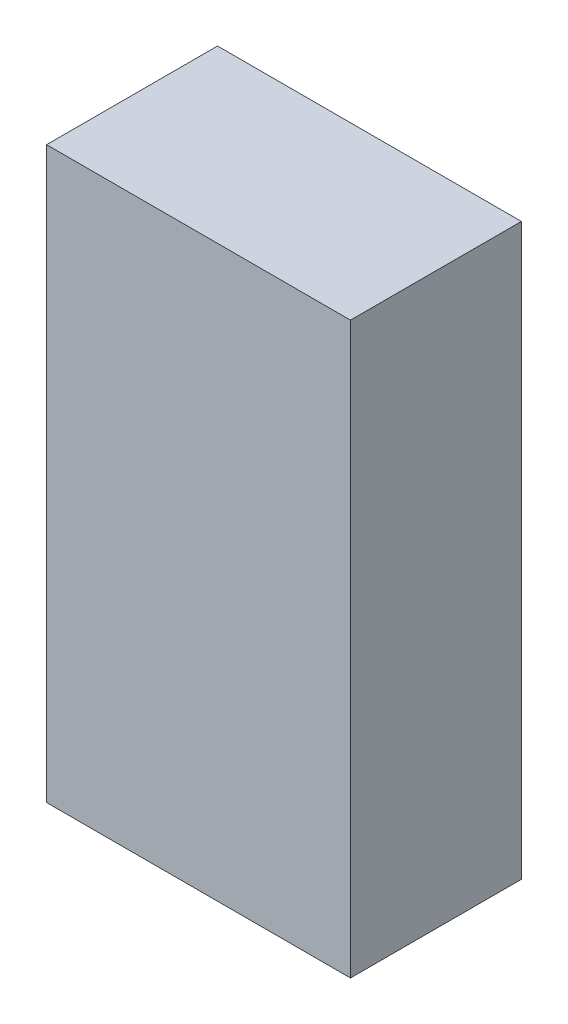
ISO-10303-21;
HEADER;
FILE_DESCRIPTION(('STEP AP214'),'2;1');
FILE_NAME('part.step','',(''),(''),'','','');
FILE_SCHEMA(('AUTOMOTIVE_DESIGN { 1 0 10303 214 1 1 1 1 }'));
ENDSEC;
DATA;
#1=APPLICATION_CONTEXT('core data for automotive mechanical design processes');
#2=APPLICATION_PROTOCOL_DEFINITION('international standard','automotive_design',2000,#1);
#3=PRODUCT_CONTEXT('',#1,'mechanical');
#4=PRODUCT('Part','Part','',(#3));
#5=PRODUCT_RELATED_PRODUCT_CATEGORY('part','',(#4));
#6=PRODUCT_DEFINITION_FORMATION('','',#4);
#7=PRODUCT_DEFINITION_CONTEXT('part definition',#1,'design');
#8=PRODUCT_DEFINITION('design','',#6,#7);
#9=PRODUCT_DEFINITION_SHAPE('','',#8);
#10=(LENGTH_UNIT() NAMED_UNIT(*) SI_UNIT(.MILLI.,.METRE.));
#11=(NAMED_UNIT(*) PLANE_ANGLE_UNIT() SI_UNIT($,.RADIAN.));
#12=(NAMED_UNIT(*) SI_UNIT($,.STERADIAN.) SOLID_ANGLE_UNIT());
#13=UNCERTAINTY_MEASURE_WITH_UNIT(LENGTH_MEASURE(1.E-05),#10,'distance_accuracy_value','');
#14=(GEOMETRIC_REPRESENTATION_CONTEXT(3) GLOBAL_UNCERTAINTY_ASSIGNED_CONTEXT((#13)) GLOBAL_UNIT_ASSIGNED_CONTEXT((#10,
#11,#12)) REPRESENTATION_CONTEXT('',''));
#15=CARTESIAN_POINT('',(0.,0.,0.));
#16=DIRECTION('',(0.,0.,1.));
#17=DIRECTION('',(1.,0.,0.));
#18=AXIS2_PLACEMENT_3D('',#15,#16,#17);
#19=CARTESIAN_POINT('',(10.450012047031,16.925007083516,0.05));
#20=DIRECTION('',(0.,0.,-1.));
#21=DIRECTION('',(0.,1.,0.));
#22=AXIS2_PLACEMENT_3D('',#19,#20,#21);
#23=PLANE('',#22);
#24=DIRECTION('',(4.371138805985E-08,-0.999999999999999,0.));
#25=VECTOR('',#24,1.);
#26=CARTESIAN_POINT('',(10.050012079815,16.175007066031,0.0499999999999998));
#27=LINE('',#26,#25);
#28=CARTESIAN_POINT('',(10.0500120470315,17.675007066031,0.0500000000000001));
#29=VERTEX_POINT('',#28);
#30=CARTESIAN_POINT('',(10.050012079815,16.1750070835155,0.0499999999999997));
#31=VERTEX_POINT('',#30);
#32=EDGE_CURVE('E58',#29,#31,#27,.T.);
#33=ORIENTED_EDGE('',*,*,#32,.F.);
#34=DIRECTION('',(-0.999999999999999,-4.371138819863E-08,0.));
#35=VECTOR('',#34,1.);
#36=CARTESIAN_POINT('',(10.050012014248,17.675007066031,0.0499999999999998));
#37=LINE('',#36,#35);
#38=CARTESIAN_POINT('',(10.850012014248,17.6750070835155,0.0500000000000001));
#39=VERTEX_POINT('',#38);
#40=EDGE_CURVE('E53',#39,#29,#37,.T.);
#41=ORIENTED_EDGE('',*,*,#40,.F.);
#42=DIRECTION('',(-4.371138819863E-08,0.999999999999999,0.));
#43=VECTOR('',#42,1.);
#44=CARTESIAN_POINT('',(10.850012014248,17.675007101,0.0499999999999998));
#45=LINE('',#44,#43);
#46=CARTESIAN_POINT('',(10.8500120634233,16.175007101,0.0499999999999997));
#47=VERTEX_POINT('',#46);
#48=EDGE_CURVE('E68',#47,#39,#45,.T.);
#49=ORIENTED_EDGE('',*,*,#48,.F.);
#50=DIRECTION('',(0.999999999999999,4.371138785169E-08,0.));
#51=VECTOR('',#50,1.);
#52=CARTESIAN_POINT('',(10.850012079815,16.175007101,0.0499999999999998));
#53=LINE('',#52,#51);
#54=EDGE_CURVE('E20',#31,#47,#53,.T.);
#55=ORIENTED_EDGE('',*,*,#54,.F.);
#56=EDGE_LOOP('',(#33,#41,#49,#55));
#57=FACE_BOUND('',#56,.T.);
#58=ADVANCED_FACE('F17',(#57),#23,.T.);
#59=CARTESIAN_POINT('',(10.850012079815,16.175007101,0.5));
#60=DIRECTION('',(4.371138785169E-08,-0.999999999999999,0.));
#61=DIRECTION('',(0.999999999999999,4.371138785169E-08,0.));
#62=AXIS2_PLACEMENT_3D('',#59,#60,#61);
#63=PLANE('',#62);
#64=ORIENTED_EDGE('',*,*,#54,.T.);
#65=DIRECTION('',(0.,0.,1.));
#66=VECTOR('',#65,1.);
#67=CARTESIAN_POINT('',(10.8500120798151,16.175007101,0.5));
#68=LINE('',#67,#66);
#69=CARTESIAN_POINT('',(10.8500120634233,16.175007101,0.5));
#70=VERTEX_POINT('',#69);
#71=EDGE_CURVE('E79',#70,#47,#68,.F.);
#72=ORIENTED_EDGE('',*,*,#71,.F.);
#73=DIRECTION('',(1.,0.,0.));
#74=VECTOR('',#73,1.);
#75=CARTESIAN_POINT('',(10.450012047031,16.175007101,0.5));
#76=LINE('',#75,#74);
#77=CARTESIAN_POINT('',(10.050012079815,16.1750070747732,0.5));
#78=VERTEX_POINT('',#77);
#79=EDGE_CURVE('E74',#70,#78,#76,.F.);
#80=ORIENTED_EDGE('',*,*,#79,.T.);
#81=DIRECTION('',(0.,0.,1.));
#82=VECTOR('',#81,1.);
#83=CARTESIAN_POINT('',(10.050012079815,16.175007066031,0.5));
#84=LINE('',#83,#82);
#85=EDGE_CURVE('E63',#31,#78,#84,.T.);
#86=ORIENTED_EDGE('',*,*,#85,.F.);
#87=EDGE_LOOP('',(#64,#72,#80,#86));
#88=FACE_BOUND('',#87,.T.);
#89=ADVANCED_FACE('F73',(#88),#63,.T.);
#90=CARTESIAN_POINT('',(10.050012079815,16.175007066031,0.5));
#91=DIRECTION('',(-0.999999999999999,-4.371138805985E-08,0.));
#92=DIRECTION('',(4.371138805985E-08,-0.999999999999999,0.));
#93=AXIS2_PLACEMENT_3D('',#90,#91,#92);
#94=PLANE('',#93);
#95=ORIENTED_EDGE('',*,*,#32,.T.);
#96=ORIENTED_EDGE('',*,*,#85,.T.);
#97=DIRECTION('',(0.,1.,0.));
#98=VECTOR('',#97,1.);
#99=CARTESIAN_POINT('',(10.050012079815,16.925007083516,0.5));
#100=LINE('',#99,#98);
#101=CARTESIAN_POINT('',(10.0500120306397,17.675007066031,0.5));
#102=VERTEX_POINT('',#101);
#103=EDGE_CURVE('E84',#78,#102,#100,.T.);
#104=ORIENTED_EDGE('',*,*,#103,.T.);
#105=DIRECTION('',(0.,0.,1.));
#106=VECTOR('',#105,1.);
#107=CARTESIAN_POINT('',(10.050012014248,17.675007066031,0.5));
#108=LINE('',#107,#106);
#109=EDGE_CURVE('E65',#29,#102,#108,.T.);
#110=ORIENTED_EDGE('',*,*,#109,.F.);
#111=EDGE_LOOP('',(#95,#96,#104,#110));
#112=FACE_BOUND('',#111,.T.);
#113=ADVANCED_FACE('F60',(#112),#94,.T.);
#114=CARTESIAN_POINT('',(10.050012014248,17.675007066031,0.5));
#115=DIRECTION('',(-4.371138819863E-08,0.999999999999999,0.));
#116=DIRECTION('',(-0.999999999999999,-4.371138819863E-08,0.));
#117=AXIS2_PLACEMENT_3D('',#114,#115,#116);
#118=PLANE('',#117);
#119=ORIENTED_EDGE('',*,*,#40,.T.);
#120=ORIENTED_EDGE('',*,*,#109,.T.);
#121=DIRECTION('',(1.,0.,0.));
#122=VECTOR('',#121,1.);
#123=CARTESIAN_POINT('',(10.450012047031,17.675007066031,0.5));
#124=LINE('',#123,#122);
#125=CARTESIAN_POINT('',(10.850012014248,17.6750070922578,0.5));
#126=VERTEX_POINT('',#125);
#127=EDGE_CURVE('E26',#102,#126,#124,.T.);
#128=ORIENTED_EDGE('',*,*,#127,.T.);
#129=DIRECTION('',(0.,0.,1.));
#130=VECTOR('',#129,1.);
#131=CARTESIAN_POINT('',(10.850012014248,17.675007101,0.5));
#132=LINE('',#131,#130);
#133=EDGE_CURVE('E34',#39,#126,#132,.T.);
#134=ORIENTED_EDGE('',*,*,#133,.F.);
#135=EDGE_LOOP('',(#119,#120,#128,#134));
#136=FACE_BOUND('',#135,.T.);
#137=ADVANCED_FACE('F88',(#136),#118,.T.);
#138=CARTESIAN_POINT('',(10.850012014248,17.675007101,0.5));
#139=DIRECTION('',(0.999999999999999,4.371138819863E-08,0.));
#140=DIRECTION('',(-4.371138819863E-08,0.999999999999999,0.));
#141=AXIS2_PLACEMENT_3D('',#138,#139,#140);
#142=PLANE('',#141);
#143=ORIENTED_EDGE('',*,*,#48,.T.);
#144=ORIENTED_EDGE('',*,*,#133,.T.);
#145=DIRECTION('',(0.,1.,0.));
#146=VECTOR('',#145,1.);
#147=CARTESIAN_POINT('',(10.850012014248,16.925007083516,0.5));
#148=LINE('',#147,#146);
#149=EDGE_CURVE('E11',#126,#70,#148,.F.);
#150=ORIENTED_EDGE('',*,*,#149,.T.);
#151=ORIENTED_EDGE('',*,*,#71,.T.);
#152=EDGE_LOOP('',(#143,#144,#150,#151));
#153=FACE_BOUND('',#152,.T.);
#154=ADVANCED_FACE('F91',(#153),#142,.T.);
#155=CARTESIAN_POINT('',(10.450012047031,16.925007083516,0.5));
#156=DIRECTION('',(0.,0.,-1.));
#157=DIRECTION('',(0.,1.,0.));
#158=AXIS2_PLACEMENT_3D('',#155,#156,#157);
#159=PLANE('',#158);
#160=ORIENTED_EDGE('',*,*,#127,.F.);
#161=ORIENTED_EDGE('',*,*,#103,.F.);
#162=ORIENTED_EDGE('',*,*,#79,.F.);
#163=ORIENTED_EDGE('',*,*,#149,.F.);
#164=EDGE_LOOP('',(#160,#161,#162,#163));
#165=FACE_BOUND('',#164,.T.);
#166=ADVANCED_FACE('F90',(#165),#159,.F.);
#167=CLOSED_SHELL('',(#58,#89,#113,#137,#154,#166));
#168=MANIFOLD_SOLID_BREP('B1',#167);
#169=ADVANCED_BREP_SHAPE_REPRESENTATION('',(#18,#168),#14);
#170=SHAPE_DEFINITION_REPRESENTATION(#9,#169);
ENDSEC;
END-ISO-10303-21;
